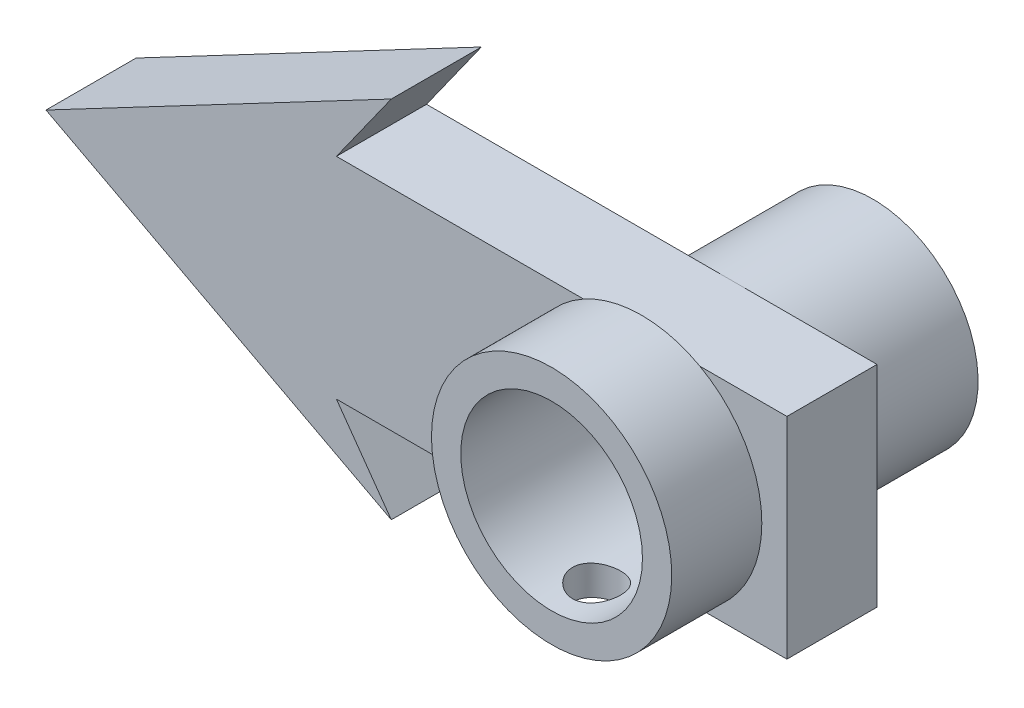
ISO-10303-21;
HEADER;
FILE_DESCRIPTION(('STEP AP214'),'2;1');
FILE_NAME('part.step','',(''),(''),'','','');
FILE_SCHEMA(('AUTOMOTIVE_DESIGN { 1 0 10303 214 1 1 1 1 }'));
ENDSEC;
DATA;
#1=APPLICATION_CONTEXT('core data for automotive mechanical design processes');
#2=APPLICATION_PROTOCOL_DEFINITION('international standard','automotive_design',2000,#1);
#3=PRODUCT_CONTEXT('',#1,'mechanical');
#4=PRODUCT('Part','Part','',(#3));
#5=PRODUCT_RELATED_PRODUCT_CATEGORY('part','',(#4));
#6=PRODUCT_DEFINITION_FORMATION('','',#4);
#7=PRODUCT_DEFINITION_CONTEXT('part definition',#1,'design');
#8=PRODUCT_DEFINITION('design','',#6,#7);
#9=PRODUCT_DEFINITION_SHAPE('','',#8);
#10=(LENGTH_UNIT() NAMED_UNIT(*) SI_UNIT(.MILLI.,.METRE.));
#11=(NAMED_UNIT(*) PLANE_ANGLE_UNIT() SI_UNIT($,.RADIAN.));
#12=(NAMED_UNIT(*) SI_UNIT($,.STERADIAN.) SOLID_ANGLE_UNIT());
#13=UNCERTAINTY_MEASURE_WITH_UNIT(LENGTH_MEASURE(1.E-05),#10,'distance_accuracy_value','');
#14=(GEOMETRIC_REPRESENTATION_CONTEXT(3) GLOBAL_UNCERTAINTY_ASSIGNED_CONTEXT((#13)) GLOBAL_UNIT_ASSIGNED_CONTEXT((#10,
#11,#12)) REPRESENTATION_CONTEXT('',''));
#15=CARTESIAN_POINT('',(0.,0.,0.));
#16=DIRECTION('',(0.,0.,1.));
#17=DIRECTION('',(1.,0.,0.));
#18=AXIS2_PLACEMENT_3D('',#15,#16,#17);
#19=CARTESIAN_POINT('',(0.,0.,0.));
#20=DIRECTION('',(0.,0.,-1.));
#21=DIRECTION('',(-1.,0.,0.));
#22=AXIS2_PLACEMENT_3D('',#19,#20,#21);
#23=PLANE('',#22);
#24=DIRECTION('',(-1.,0.,0.));
#25=VECTOR('',#24,1.);
#26=CARTESIAN_POINT('',(9.67008036930227,3.5,0.));
#27=LINE('',#26,#25);
#28=CARTESIAN_POINT('',(24.6700803693023,3.5,0.));
#29=VERTEX_POINT('',#28);
#30=CARTESIAN_POINT('',(19.8350401846511,3.5,0.));
#31=VERTEX_POINT('',#30);
#32=EDGE_CURVE('E169',#29,#31,#27,.T.);
#33=ORIENTED_EDGE('',*,*,#32,.F.);
#34=DIRECTION('',(0.,1.,0.));
#35=VECTOR('',#34,1.);
#36=CARTESIAN_POINT('',(24.6700803693023,3.5,0.));
#37=LINE('',#36,#35);
#38=CARTESIAN_POINT('',(24.6700803693023,-3.5,0.));
#39=VERTEX_POINT('',#38);
#40=EDGE_CURVE('E129',#39,#29,#37,.T.);
#41=ORIENTED_EDGE('',*,*,#40,.F.);
#42=DIRECTION('',(1.,0.,0.));
#43=VECTOR('',#42,1.);
#44=CARTESIAN_POINT('',(9.67008036930227,-3.5,0.));
#45=LINE('',#44,#43);
#46=CARTESIAN_POINT('',(19.8350401846511,-3.5,0.));
#47=VERTEX_POINT('',#46);
#48=EDGE_CURVE('E128',#47,#39,#45,.T.);
#49=ORIENTED_EDGE('',*,*,#48,.F.);
#50=CARTESIAN_POINT('',(19.8350401846511,0.,0.));
#51=DIRECTION('',(0.,0.,-1.));
#52=DIRECTION('',(-1.,0.,0.));
#53=AXIS2_PLACEMENT_3D('',#50,#51,#52);
#54=CIRCLE('',#53,3.5);
#55=EDGE_CURVE('E46',#31,#47,#54,.T.);
#56=ORIENTED_EDGE('',*,*,#55,.F.);
#57=EDGE_LOOP('',(#33,#41,#49,#56));
#58=FACE_BOUND('',#57,.T.);
#59=ADVANCED_FACE('F35',(#58),#23,.T.);
#60=CARTESIAN_POINT('',(9.67008036930227,-3.5,3.));
#61=DIRECTION('',(0.,1.,0.));
#62=DIRECTION('',(-1.,0.,0.));
#63=AXIS2_PLACEMENT_3D('',#60,#61,#62);
#64=PLANE('',#63);
#65=DIRECTION('',(0.,0.,-1.));
#66=VECTOR('',#65,1.);
#67=CARTESIAN_POINT('',(24.6700803693023,-3.5,3.));
#68=LINE('',#67,#66);
#69=CARTESIAN_POINT('',(24.6700803693023,-3.5,3.));
#70=VERTEX_POINT('',#69);
#71=EDGE_CURVE('E115',#70,#39,#68,.T.);
#72=ORIENTED_EDGE('',*,*,#71,.F.);
#73=DIRECTION('',(1.,0.,0.));
#74=VECTOR('',#73,1.);
#75=CARTESIAN_POINT('',(9.67008036930227,-3.5,3.));
#76=LINE('',#75,#74);
#77=CARTESIAN_POINT('',(21.7715318577548,-3.5,3.));
#78=VERTEX_POINT('',#77);
#79=EDGE_CURVE('E125',#78,#70,#76,.T.);
#80=ORIENTED_EDGE('',*,*,#79,.F.);
#81=CARTESIAN_POINT('',(17.8985485115474,-3.5,3.));
#82=VERTEX_POINT('',#81);
#83=EDGE_CURVE('E134',#82,#78,#76,.T.);
#84=ORIENTED_EDGE('',*,*,#83,.F.);
#85=CARTESIAN_POINT('',(9.67008036930227,-3.5,3.));
#86=VERTEX_POINT('',#85);
#87=EDGE_CURVE('E137',#86,#82,#76,.T.);
#88=ORIENTED_EDGE('',*,*,#87,.F.);
#89=DIRECTION('',(0.,0.,-1.));
#90=VECTOR('',#89,1.);
#91=CARTESIAN_POINT('',(9.67008036930227,-3.5,3.));
#92=LINE('',#91,#90);
#93=CARTESIAN_POINT('',(9.67008036930227,-3.5,0.));
#94=VERTEX_POINT('',#93);
#95=EDGE_CURVE('E182',#86,#94,#92,.T.);
#96=ORIENTED_EDGE('',*,*,#95,.T.);
#97=EDGE_CURVE('E166',#94,#47,#45,.T.);
#98=ORIENTED_EDGE('',*,*,#97,.T.);
#99=ORIENTED_EDGE('',*,*,#48,.T.);
#100=EDGE_LOOP('',(#72,#80,#84,#88,#96,#98,#99));
#101=FACE_BOUND('',#100,.T.);
#102=ADVANCED_FACE('F124',(#101),#64,.F.);
#103=CARTESIAN_POINT('',(9.67008036930227,3.5,3.));
#104=DIRECTION('',(0.,-1.,0.));
#105=DIRECTION('',(1.,0.,0.));
#106=AXIS2_PLACEMENT_3D('',#103,#104,#105);
#107=PLANE('',#106);
#108=DIRECTION('',(0.,0.,1.));
#109=VECTOR('',#108,1.);
#110=CARTESIAN_POINT('',(24.6700803693023,3.5,3.));
#111=LINE('',#110,#109);
#112=CARTESIAN_POINT('',(24.6700803693023,3.5,3.));
#113=VERTEX_POINT('',#112);
#114=EDGE_CURVE('E53',#29,#113,#111,.T.);
#115=ORIENTED_EDGE('',*,*,#114,.F.);
#116=ORIENTED_EDGE('',*,*,#32,.T.);
#117=CARTESIAN_POINT('',(9.67008036930227,3.5,0.));
#118=VERTEX_POINT('',#117);
#119=EDGE_CURVE('E168',#31,#118,#27,.T.);
#120=ORIENTED_EDGE('',*,*,#119,.T.);
#121=DIRECTION('',(0.,0.,-1.));
#122=VECTOR('',#121,1.);
#123=CARTESIAN_POINT('',(9.67008036930227,3.5,3.));
#124=LINE('',#123,#122);
#125=CARTESIAN_POINT('',(9.67008036930227,3.5,3.));
#126=VERTEX_POINT('',#125);
#127=EDGE_CURVE('E180',#126,#118,#124,.T.);
#128=ORIENTED_EDGE('',*,*,#127,.F.);
#129=DIRECTION('',(-1.,0.,0.));
#130=VECTOR('',#129,1.);
#131=CARTESIAN_POINT('',(9.67008036930227,3.5,3.));
#132=LINE('',#131,#130);
#133=CARTESIAN_POINT('',(17.8985485115474,3.5,3.));
#134=VERTEX_POINT('',#133);
#135=EDGE_CURVE('E142',#134,#126,#132,.T.);
#136=ORIENTED_EDGE('',*,*,#135,.F.);
#137=CARTESIAN_POINT('',(21.7715318577548,3.5,3.));
#138=VERTEX_POINT('',#137);
#139=EDGE_CURVE('E146',#138,#134,#132,.T.);
#140=ORIENTED_EDGE('',*,*,#139,.F.);
#141=EDGE_CURVE('E147',#113,#138,#132,.T.);
#142=ORIENTED_EDGE('',*,*,#141,.F.);
#143=EDGE_LOOP('',(#115,#116,#120,#128,#136,#140,#142));
#144=FACE_BOUND('',#143,.T.);
#145=ADVANCED_FACE('F258',(#144),#107,.F.);
#146=CARTESIAN_POINT('',(0.,0.,3.));
#147=DIRECTION('',(0.,0.,-1.));
#148=DIRECTION('',(-1.,0.,0.));
#149=AXIS2_PLACEMENT_3D('',#146,#147,#148);
#150=PLANE('',#149);
#151=DIRECTION('',(0.,-1.,0.));
#152=VECTOR('',#151,1.);
#153=CARTESIAN_POINT('',(24.6700803693023,3.5,3.));
#154=LINE('',#153,#152);
#155=EDGE_CURVE('E112',#113,#70,#154,.T.);
#156=ORIENTED_EDGE('',*,*,#155,.F.);
#157=ORIENTED_EDGE('',*,*,#141,.T.);
#158=CARTESIAN_POINT('',(19.8350401846511,0.,3.));
#159=DIRECTION('',(0.,0.,1.));
#160=DIRECTION('',(1.,0.,0.));
#161=AXIS2_PLACEMENT_3D('',#158,#159,#160);
#162=CIRCLE('',#161,4.);
#163=EDGE_CURVE('E133',#78,#138,#162,.T.);
#164=ORIENTED_EDGE('',*,*,#163,.F.);
#165=ORIENTED_EDGE('',*,*,#79,.T.);
#166=EDGE_LOOP('',(#156,#157,#164,#165));
#167=FACE_BOUND('',#166,.T.);
#168=ADVANCED_FACE('F131',(#167),#150,.F.);
#169=EDGE_CURVE('E44',#134,#82,#162,.T.);
#170=ORIENTED_EDGE('',*,*,#169,.F.);
#171=ORIENTED_EDGE('',*,*,#135,.T.);
#172=DIRECTION('',(0.580022620305098,0.814600368238567,0.));
#173=VECTOR('',#172,1.);
#174=CARTESIAN_POINT('',(11.4976326065654,6.06666666666667,3.));
#175=LINE('',#174,#173);
#176=CARTESIAN_POINT('',(11.4976326065654,6.06666666666667,3.));
#177=VERTEX_POINT('',#176);
#178=EDGE_CURVE('E152',#126,#177,#175,.T.);
#179=ORIENTED_EDGE('',*,*,#178,.T.);
#180=DIRECTION('',(-0.884433277428106,-0.466666666666667,0.));
#181=VECTOR('',#180,1.);
#182=CARTESIAN_POINT('',(0.,0.,3.));
#183=LINE('',#182,#181);
#184=CARTESIAN_POINT('',(0.,0.,3.));
#185=VERTEX_POINT('',#184);
#186=EDGE_CURVE('E154',#177,#185,#183,.T.);
#187=ORIENTED_EDGE('',*,*,#186,.T.);
#188=DIRECTION('',(0.884433277428106,-0.466666666666667,0.));
#189=VECTOR('',#188,1.);
#190=CARTESIAN_POINT('',(0.,0.,3.));
#191=LINE('',#190,#189);
#192=CARTESIAN_POINT('',(11.4976326065654,-6.06666666666667,3.));
#193=VERTEX_POINT('',#192);
#194=EDGE_CURVE('E138',#185,#193,#191,.T.);
#195=ORIENTED_EDGE('',*,*,#194,.T.);
#196=DIRECTION('',(-0.580022620305098,0.814600368238567,0.));
#197=VECTOR('',#196,1.);
#198=CARTESIAN_POINT('',(11.4976326065654,-6.06666666666667,3.));
#199=LINE('',#198,#197);
#200=EDGE_CURVE('E135',#193,#86,#199,.T.);
#201=ORIENTED_EDGE('',*,*,#200,.T.);
#202=ORIENTED_EDGE('',*,*,#87,.T.);
#203=EDGE_LOOP('',(#170,#171,#179,#187,#195,#201,#202));
#204=FACE_BOUND('',#203,.T.);
#205=ADVANCED_FACE('F290',(#204),#150,.F.);
#206=CARTESIAN_POINT('',(0.,0.,3.));
#207=DIRECTION('',(0.466666666666667,0.884433277428107,0.));
#208=DIRECTION('',(-0.884433277428107,0.466666666666667,0.));
#209=AXIS2_PLACEMENT_3D('',#206,#207,#208);
#210=PLANE('',#209);
#211=DIRECTION('',(0.884433277428106,-0.466666666666667,0.));
#212=VECTOR('',#211,1.);
#213=CARTESIAN_POINT('',(0.,0.,0.));
#214=LINE('',#213,#212);
#215=CARTESIAN_POINT('',(0.,0.,0.));
#216=VERTEX_POINT('',#215);
#217=CARTESIAN_POINT('',(11.4976326065654,-6.06666666666667,0.));
#218=VERTEX_POINT('',#217);
#219=EDGE_CURVE('E160',#216,#218,#214,.T.);
#220=ORIENTED_EDGE('',*,*,#219,.T.);
#221=DIRECTION('',(0.,0.,-1.));
#222=VECTOR('',#221,1.);
#223=CARTESIAN_POINT('',(11.4976326065654,-6.06666666666667,3.));
#224=LINE('',#223,#222);
#225=EDGE_CURVE('E39',#193,#218,#224,.T.);
#226=ORIENTED_EDGE('',*,*,#225,.F.);
#227=ORIENTED_EDGE('',*,*,#194,.F.);
#228=DIRECTION('',(0.,0.,-1.));
#229=VECTOR('',#228,1.);
#230=CARTESIAN_POINT('',(0.,0.,3.));
#231=LINE('',#230,#229);
#232=EDGE_CURVE('E157',#185,#216,#231,.T.);
#233=ORIENTED_EDGE('',*,*,#232,.T.);
#234=EDGE_LOOP('',(#220,#226,#227,#233));
#235=FACE_BOUND('',#234,.T.);
#236=ADVANCED_FACE('F37',(#235),#210,.F.);
#237=CARTESIAN_POINT('',(11.4976326065654,-6.06666666666667,3.));
#238=DIRECTION('',(-0.814600368238567,-0.580022620305098,0.));
#239=DIRECTION('',(0.580022620305098,-0.814600368238567,0.));
#240=AXIS2_PLACEMENT_3D('',#237,#238,#239);
#241=PLANE('',#240);
#242=DIRECTION('',(-0.580022620305098,0.814600368238567,0.));
#243=VECTOR('',#242,1.);
#244=CARTESIAN_POINT('',(11.4976326065654,-6.06666666666667,0.));
#245=LINE('',#244,#243);
#246=EDGE_CURVE('E163',#218,#94,#245,.T.);
#247=ORIENTED_EDGE('',*,*,#246,.T.);
#248=ORIENTED_EDGE('',*,*,#95,.F.);
#249=ORIENTED_EDGE('',*,*,#200,.F.);
#250=ORIENTED_EDGE('',*,*,#225,.T.);
#251=EDGE_LOOP('',(#247,#248,#249,#250));
#252=FACE_BOUND('',#251,.T.);
#253=ADVANCED_FACE('F280',(#252),#241,.F.);
#254=CARTESIAN_POINT('',(11.4976326065654,6.06666666666667,3.));
#255=DIRECTION('',(-0.814600368238567,0.580022620305098,0.));
#256=DIRECTION('',(-0.580022620305098,-0.814600368238567,0.));
#257=AXIS2_PLACEMENT_3D('',#254,#255,#256);
#258=PLANE('',#257);
#259=DIRECTION('',(0.580022620305098,0.814600368238567,0.));
#260=VECTOR('',#259,1.);
#261=CARTESIAN_POINT('',(11.4976326065654,6.06666666666667,0.));
#262=LINE('',#261,#260);
#263=CARTESIAN_POINT('',(11.4976326065654,6.06666666666667,0.));
#264=VERTEX_POINT('',#263);
#265=EDGE_CURVE('E171',#118,#264,#262,.T.);
#266=ORIENTED_EDGE('',*,*,#265,.T.);
#267=DIRECTION('',(0.,0.,-1.));
#268=VECTOR('',#267,1.);
#269=CARTESIAN_POINT('',(11.4976326065654,6.06666666666667,3.));
#270=LINE('',#269,#268);
#271=EDGE_CURVE('E177',#177,#264,#270,.T.);
#272=ORIENTED_EDGE('',*,*,#271,.F.);
#273=ORIENTED_EDGE('',*,*,#178,.F.);
#274=ORIENTED_EDGE('',*,*,#127,.T.);
#275=EDGE_LOOP('',(#266,#272,#273,#274));
#276=FACE_BOUND('',#275,.T.);
#277=ADVANCED_FACE('F275',(#276),#258,.F.);
#278=CARTESIAN_POINT('',(0.,0.,3.));
#279=DIRECTION('',(0.466666666666667,-0.884433277428107,0.));
#280=DIRECTION('',(0.884433277428107,0.466666666666667,0.));
#281=AXIS2_PLACEMENT_3D('',#278,#279,#280);
#282=PLANE('',#281);
#283=DIRECTION('',(-0.884433277428106,-0.466666666666667,0.));
#284=VECTOR('',#283,1.);
#285=CARTESIAN_POINT('',(0.,0.,0.));
#286=LINE('',#285,#284);
#287=EDGE_CURVE('E173',#264,#216,#286,.T.);
#288=ORIENTED_EDGE('',*,*,#287,.T.);
#289=ORIENTED_EDGE('',*,*,#232,.F.);
#290=ORIENTED_EDGE('',*,*,#186,.F.);
#291=ORIENTED_EDGE('',*,*,#271,.T.);
#292=EDGE_LOOP('',(#288,#289,#290,#291));
#293=FACE_BOUND('',#292,.T.);
#294=ADVANCED_FACE('F265',(#293),#282,.F.);
#295=EDGE_CURVE('E11',#47,#31,#54,.T.);
#296=ORIENTED_EDGE('',*,*,#295,.F.);
#297=ORIENTED_EDGE('',*,*,#97,.F.);
#298=ORIENTED_EDGE('',*,*,#246,.F.);
#299=ORIENTED_EDGE('',*,*,#219,.F.);
#300=ORIENTED_EDGE('',*,*,#287,.F.);
#301=ORIENTED_EDGE('',*,*,#265,.F.);
#302=ORIENTED_EDGE('',*,*,#119,.F.);
#303=EDGE_LOOP('',(#296,#297,#298,#299,#300,#301,#302));
#304=FACE_BOUND('',#303,.T.);
#305=ADVANCED_FACE('F253',(#304),#23,.T.);
#306=CARTESIAN_POINT('',(19.8350401846511,0.,3.));
#307=DIRECTION('',(0.,0.,1.));
#308=DIRECTION('',(1.,0.,0.));
#309=AXIS2_PLACEMENT_3D('',#306,#307,#308);
#310=PLANE('',#309);
#311=EDGE_CURVE('E195',#82,#78,#162,.T.);
#312=ORIENTED_EDGE('',*,*,#311,.F.);
#313=ORIENTED_EDGE('',*,*,#83,.T.);
#314=EDGE_LOOP('',(#312,#313));
#315=FACE_BOUND('',#314,.T.);
#316=ADVANCED_FACE('F264',(#315),#310,.F.);
#317=EDGE_CURVE('E189',#138,#134,#162,.T.);
#318=ORIENTED_EDGE('',*,*,#317,.F.);
#319=ORIENTED_EDGE('',*,*,#139,.T.);
#320=EDGE_LOOP('',(#318,#319));
#321=FACE_BOUND('',#320,.T.);
#322=ADVANCED_FACE('F271',(#321),#310,.F.);
#323=CARTESIAN_POINT('',(19.8350401846511,0.,6.));
#324=DIRECTION('',(0.,0.,-1.));
#325=DIRECTION('',(-1.,0.,0.));
#326=AXIS2_PLACEMENT_3D('',#323,#324,#325);
#327=CYLINDRICAL_SURFACE('',#326,4.);
#328=CARTESIAN_POINT('',(19.8350401846511,-4.,5.3));
#329=CARTESIAN_POINT('',(19.790578659217,-3.99999918064697,5.29999836440132));
#330=CARTESIAN_POINT('',(19.7460964564899,-3.99925108142585,5.29628092562588));
#331=CARTESIAN_POINT('',(19.6583893784999,-3.99633892498585,5.2815211999078));
#332=CARTESIAN_POINT('',(19.6151655306181,-3.99417374288149,5.27047309375879));
#333=CARTESIAN_POINT('',(19.5312559404405,-3.98866919422629,5.24140698110337));
#334=CARTESIAN_POINT('',(19.4905678103046,-3.98533095261374,5.22339565052425));
#335=CARTESIAN_POINT('',(19.4127937935598,-3.97784318428251,5.18093420199096));
#336=CARTESIAN_POINT('',(19.3757076925905,-3.97369370588566,5.15648446751424));
#337=CARTESIAN_POINT('',(19.3056854027992,-3.96497732263976,5.10148920456685));
#338=CARTESIAN_POINT('',(19.2728050237243,-3.96040596403478,5.07087331568704));
#339=CARTESIAN_POINT('',(19.2126107793647,-3.95139344362071,5.00456606688664));
#340=CARTESIAN_POINT('',(19.1852973488348,-3.94695229200339,4.9688743109319));
#341=CARTESIAN_POINT('',(19.136774781973,-3.93865953450092,4.8930270455905));
#342=CARTESIAN_POINT('',(19.1156234335584,-3.93481365891957,4.85283388496291));
#343=CARTESIAN_POINT('',(19.0803956513869,-3.92821014446734,4.76937454479674));
#344=CARTESIAN_POINT('',(19.0663185187013,-3.92545239809569,4.72610866932292));
#345=CARTESIAN_POINT('',(19.0458199447433,-3.92138244201764,4.63833250887367));
#346=CARTESIAN_POINT('',(19.0393005862841,-3.9200517608575,4.59384596468622));
#347=CARTESIAN_POINT('',(19.0337984824702,-3.91893100048502,4.50439214290853));
#348=CARTESIAN_POINT('',(19.0348149664803,-3.91914076374272,4.45942491494388));
#349=CARTESIAN_POINT('',(19.0442765261697,-3.92106040918548,4.3710025695832));
#350=CARTESIAN_POINT('',(19.052609352456,-3.92274762287011,4.32753487549815));
#351=CARTESIAN_POINT('',(19.0762898769527,-3.92739636928001,4.2426271386696));
#352=CARTESIAN_POINT('',(19.0916379101706,-3.93035796286223,4.20118719286479));
#353=CARTESIAN_POINT('',(19.1290203577114,-3.93724494800326,4.12118779063712));
#354=CARTESIAN_POINT('',(19.1510992636654,-3.94117671850963,4.08264969634466));
#355=CARTESIAN_POINT('',(19.201285324993,-3.94955695018449,4.00978332002175));
#356=CARTESIAN_POINT('',(19.2293931731657,-3.95400547070693,3.97545552251908));
#357=CARTESIAN_POINT('',(19.2914402370027,-3.96301616993169,3.91133647803445));
#358=CARTESIAN_POINT('',(19.3254752556812,-3.96757895368724,3.8816379457127));
#359=CARTESIAN_POINT('',(19.3980921654015,-3.97623078971527,3.82835692295902));
#360=CARTESIAN_POINT('',(19.4366741147476,-3.98031983591179,3.80477451096514));
#361=CARTESIAN_POINT('',(19.517392675148,-3.9875735212871,3.76437799261922));
#362=CARTESIAN_POINT('',(19.5595347289829,-3.99073671078617,3.74757448508437));
#363=CARTESIAN_POINT('',(19.6461210034922,-3.99577127190287,3.72131162076915));
#364=CARTESIAN_POINT('',(19.6905649445932,-3.99764280000425,3.7118513743411));
#365=CARTESIAN_POINT('',(19.7796966601494,-3.99986137493494,3.70067483696458));
#366=CARTESIAN_POINT('',(19.8243679219907,-4.00023339721976,3.69883166436779));
#367=CARTESIAN_POINT('',(19.9133801320053,-3.99948041544082,3.70259988715374));
#368=CARTESIAN_POINT('',(19.9577210986062,-3.99835549553157,3.70821086348208));
#369=CARTESIAN_POINT('',(20.0444047126084,-3.99475065606414,3.72662269883516));
#370=CARTESIAN_POINT('',(20.0867617433231,-3.99228301123365,3.73935845479832));
#371=CARTESIAN_POINT('',(20.1687390866509,-3.98626841648826,3.77158718612465));
#372=CARTESIAN_POINT('',(20.2083591939612,-3.98272138571381,3.79108066774146));
#373=CARTESIAN_POINT('',(20.2842731236001,-3.97487929226635,3.83654599252105));
#374=CARTESIAN_POINT('',(20.3205202860529,-3.97057560349641,3.86259422483116));
#375=CARTESIAN_POINT('',(20.3881745999465,-3.96171787863906,3.92032735296583));
#376=CARTESIAN_POINT('',(20.4195812317957,-3.9571638157471,3.95201285311989));
#377=CARTESIAN_POINT('',(20.4771526572705,-3.94823442845572,4.0206986815129));
#378=CARTESIAN_POINT('',(20.5032303466101,-3.94386288186643,4.05777259537707));
#379=CARTESIAN_POINT('',(20.5487885206921,-3.93587353436955,4.13584908908534));
#380=CARTESIAN_POINT('',(20.5682692693895,-3.93225570330674,4.17685151165884));
#381=CARTESIAN_POINT('',(20.5999616579167,-3.92621392467506,4.26141459691963));
#382=CARTESIAN_POINT('',(20.612210984484,-3.92378379897749,4.30496067296825));
#383=CARTESIAN_POINT('',(20.6292071059529,-3.9203794943362,4.39354676279272));
#384=CARTESIAN_POINT('',(20.6339548792312,-3.91940512552889,4.43858658096747));
#385=CARTESIAN_POINT('',(20.6357769133451,-3.91903319705103,4.52800709163545));
#386=CARTESIAN_POINT('',(20.6329888151079,-3.91960735351441,4.5723849191416));
#387=CARTESIAN_POINT('',(20.6201220279312,-3.92220458787691,4.66002531992402));
#388=CARTESIAN_POINT('',(20.6100433975546,-3.92422765413735,4.70328790215584));
#389=CARTESIAN_POINT('',(20.5829430394503,-3.92948211375327,4.78738216899243));
#390=CARTESIAN_POINT('',(20.565938190025,-3.93271056815064,4.82821948840193));
#391=CARTESIAN_POINT('',(20.5254839003324,-3.94001371979336,4.90648297658755));
#392=CARTESIAN_POINT('',(20.502033919671,-3.94408848799115,4.94390885898011));
#393=CARTESIAN_POINT('',(20.4488849164803,-3.9527116841858,5.01497245772025));
#394=CARTESIAN_POINT('',(20.4190864944393,-3.9572669832776,5.04853501221407));
#395=CARTESIAN_POINT('',(20.3542916798616,-3.96628865497564,5.11022896442333));
#396=CARTESIAN_POINT('',(20.3192940943738,-3.97075500690547,5.13835911225381));
#397=CARTESIAN_POINT('',(20.2446542879217,-3.97915065910377,5.18866771515715));
#398=CARTESIAN_POINT('',(20.204967292195,-3.98307384975397,5.21078080262402));
#399=CARTESIAN_POINT('',(20.1223732734037,-3.98988100068,5.24798889807727));
#400=CARTESIAN_POINT('',(20.0794691933416,-3.99276589710893,5.26309023162599));
#401=CARTESIAN_POINT('',(20.0028973757902,-3.99661098076296,5.28292155843577));
#402=CARTESIAN_POINT('',(19.9696655158622,-3.99787442526761,5.2893145549662));
#403=CARTESIAN_POINT('',(19.9026398048192,-3.99956923311914,5.29785432988669));
#404=CARTESIAN_POINT('',(19.86884597165,-4.00000062298524,5.30000124360781));
#405=CARTESIAN_POINT('',(19.8350401846511,-4.,5.3));
#406=B_SPLINE_CURVE_WITH_KNOTS('',3,(#328,#329,#330,#331,#332,#333,#334,#335,#336,#337,#338,
#339,#340,#341,#342,#343,#344,#345,#346,#347,#348,#349,#350,#351,#352,#353,#354,#355,#356,#357,
#358,#359,#360,#361,#362,#363,#364,#365,#366,#367,#368,#369,#370,#371,#372,#373,#374,#375,#376,
#377,#378,#379,#380,#381,#382,#383,#384,#385,#386,#387,#388,#389,#390,#391,#392,#393,#394,#395,
#396,#397,#398,#399,#400,#401,#402,#403,#404,#405),.UNSPECIFIED.,.T.,.F.,(4,2,2,2,2,2,2,2,2,2,2,
2,2,2,2,2,2,2,2,2,2,2,2,2,2,2,2,2,2,2,2,2,2,2,2,2,2,2,4),(0.,0.133260904529008,
0.266627720553057,0.39986698820027,0.533098321784688,0.667946136089745,0.802804477397891,
0.938889560047378,1.07496119492157,1.20924948082869,1.3435240342498,1.47577381605022,
1.60802991402983,1.74117992162873,1.87434523799736,2.0099060199308,2.14546854031856,
2.28124219883219,2.41699940558428,2.55048588541012,2.68396486126294,2.81624363160578,
2.94853231372817,3.08244052826686,3.21636310676744,3.3523250286338,3.48828150978772,
3.62352304826177,3.75874694664331,3.8915177805416,4.02428754794086,4.15673569002487,
4.28919494065492,4.42390460991314,4.55864523626344,4.69479597340509,4.83082364414014,
4.93215020231914,5.03347353096796),.UNSPECIFIED.);
#407=CARTESIAN_POINT('',(19.8350401846511,-4.,5.3));
#408=VERTEX_POINT('',#407);
#409=EDGE_CURVE('E206',#408,#408,#406,.T.);
#410=ORIENTED_EDGE('',*,*,#409,.F.);
#411=EDGE_LOOP('',(#410));
#412=FACE_BOUND('',#411,.T.);
#413=CARTESIAN_POINT('',(19.8350401846511,0.,6.));
#414=DIRECTION('',(0.,0.,1.));
#415=DIRECTION('',(1.,0.,0.));
#416=AXIS2_PLACEMENT_3D('',#413,#414,#415);
#417=CIRCLE('',#416,4.);
#418=CARTESIAN_POINT('',(23.8350401846511,0.,6.));
#419=VERTEX_POINT('',#418);
#420=EDGE_CURVE('E164',#419,#419,#417,.T.);
#421=ORIENTED_EDGE('',*,*,#420,.F.);
#422=EDGE_LOOP('',(#421));
#423=FACE_BOUND('',#422,.T.);
#424=ORIENTED_EDGE('',*,*,#317,.T.);
#425=ORIENTED_EDGE('',*,*,#169,.T.);
#426=ORIENTED_EDGE('',*,*,#311,.T.);
#427=ORIENTED_EDGE('',*,*,#163,.T.);
#428=EDGE_LOOP('',(#424,#425,#426,#427));
#429=FACE_BOUND('',#428,.T.);
#430=ADVANCED_FACE('F310',(#412,#423,#429),#327,.T.);
#431=CARTESIAN_POINT('',(19.8350401846511,0.,6.));
#432=DIRECTION('',(0.,0.,1.));
#433=DIRECTION('',(1.,0.,0.));
#434=AXIS2_PLACEMENT_3D('',#431,#432,#433);
#435=PLANE('',#434);
#436=CARTESIAN_POINT('',(19.8350401846511,0.,6.));
#437=DIRECTION('',(0.,0.,1.));
#438=DIRECTION('',(1.,0.,0.));
#439=AXIS2_PLACEMENT_3D('',#436,#437,#438);
#440=CIRCLE('',#439,3.025);
#441=CARTESIAN_POINT('',(22.8600401846511,0.,6.));
#442=VERTEX_POINT('',#441);
#443=EDGE_CURVE('E199',#442,#442,#440,.T.);
#444=ORIENTED_EDGE('',*,*,#443,.F.);
#445=EDGE_LOOP('',(#444));
#446=FACE_BOUND('',#445,.T.);
#447=ORIENTED_EDGE('',*,*,#420,.T.);
#448=EDGE_LOOP('',(#447));
#449=FACE_BOUND('',#448,.T.);
#450=ADVANCED_FACE('F314',(#446,#449),#435,.T.);
#451=CARTESIAN_POINT('',(19.8350401846511,0.,-0.00100000000000013));
#452=DIRECTION('',(0.,0.,1.));
#453=DIRECTION('',(1.,0.,0.));
#454=AXIS2_PLACEMENT_3D('',#451,#452,#453);
#455=CYLINDRICAL_SURFACE('',#454,3.025);
#456=CARTESIAN_POINT('',(19.8350401846511,-3.025,5.3));
#457=CARTESIAN_POINT('',(19.8791553962452,-3.02499932224319,5.29999892545121));
#458=CARTESIAN_POINT('',(19.9232821865711,-3.0240254531158,5.29633872579703));
#459=CARTESIAN_POINT('',(20.0102654801861,-3.02023504644452,5.28182000667694));
#460=CARTESIAN_POINT('',(20.0531213466025,-3.01741760084727,5.27095793989727));
#461=CARTESIAN_POINT('',(20.1362945785452,-3.01025115086492,5.24241266354656));
#462=CARTESIAN_POINT('',(20.1766151105835,-3.00590410353821,5.22473816743665));
#463=CARTESIAN_POINT('',(20.2537195262333,-2.99613833625605,5.18310182660626));
#464=CARTESIAN_POINT('',(20.2905031894552,-2.99071954958252,5.15913959043008));
#465=CARTESIAN_POINT('',(20.3603297357938,-2.9792574187581,5.10503018677773));
#466=CARTESIAN_POINT('',(20.3932803392676,-2.973203538056,5.07476616426055));
#467=CARTESIAN_POINT('',(20.4537025169986,-2.96122150040223,5.00916212500279));
#468=CARTESIAN_POINT('',(20.4811733981312,-2.9552933594399,4.9738214670949));
#469=CARTESIAN_POINT('',(20.530304109301,-2.9441264396478,4.89833348706738));
#470=CARTESIAN_POINT('',(20.5518581769232,-2.93890096585341,4.8581151816542));
#471=CARTESIAN_POINT('',(20.587862349401,-2.92988577514898,4.77446509721844));
#472=CARTESIAN_POINT('',(20.6023137402393,-2.92609579836202,4.73103390154864));
#473=CARTESIAN_POINT('',(20.6233826216071,-2.92048943499608,4.64321189972327));
#474=CARTESIAN_POINT('',(20.6301672343293,-2.91863101927515,4.59886393489742));
#475=CARTESIAN_POINT('',(20.6362309340062,-2.91697259096672,4.50962332135602));
#476=CARTESIAN_POINT('',(20.6355113984391,-2.91717220060345,4.46473077411636));
#477=CARTESIAN_POINT('',(20.6267199943164,-2.9195696315441,4.37697654304662));
#478=CARTESIAN_POINT('',(20.6188499284014,-2.92171260403595,4.33409290599841));
#479=CARTESIAN_POINT('',(20.5963039032491,-2.92766753404706,4.25027745595959));
#480=CARTESIAN_POINT('',(20.5816274080528,-2.93147962299634,4.20934579695366));
#481=CARTESIAN_POINT('',(20.5457196788588,-2.94039177500884,4.13006813518248));
#482=CARTESIAN_POINT('',(20.5244173610819,-2.9455056908745,4.09175595184956));
#483=CARTESIAN_POINT('',(20.475912288297,-2.95643779011322,4.01917889128369));
#484=CARTESIAN_POINT('',(20.4487083891106,-2.96225610995689,3.98491480087353));
#485=CARTESIAN_POINT('',(20.3881387114584,-2.97417010530146,3.92025310120462));
#486=CARTESIAN_POINT('',(20.3546033556075,-2.98026869274261,3.89001465420732));
#487=CARTESIAN_POINT('',(20.2828633535916,-2.99188867872063,3.83555854546924));
#488=CARTESIAN_POINT('',(20.2446585294348,-2.99741005524037,3.81134111334546));
#489=CARTESIAN_POINT('',(20.1644202393951,-3.00728655459728,3.76954599590647));
#490=CARTESIAN_POINT('',(20.122371322146,-3.01163666621077,3.75199671253727));
#491=CARTESIAN_POINT('',(20.0357788166024,-3.01864424778725,3.72426187219438));
#492=CARTESIAN_POINT('',(19.9912357663869,-3.02130208131986,3.71407473347143));
#493=CARTESIAN_POINT('',(19.9022780662337,-3.02457081847858,3.70160233546438));
#494=CARTESIAN_POINT('',(19.8578957765689,-3.02523777448174,3.69910063495982));
#495=CARTESIAN_POINT('',(19.7693459300956,-3.02461055825274,3.70147295252101));
#496=CARTESIAN_POINT('',(19.7251783519416,-3.02331658513738,3.70634622171699));
#497=CARTESIAN_POINT('',(19.6390814288204,-3.01894906954996,3.72315248871173));
#498=CARTESIAN_POINT('',(19.5971269072056,-3.01590588650307,3.73496512151639));
#499=CARTESIAN_POINT('',(19.5157987695946,-3.00838483101976,3.76517533547686));
#500=CARTESIAN_POINT('',(19.4764254314277,-3.00390680444642,3.78357362411644));
#501=CARTESIAN_POINT('',(19.4005335787807,-2.99388104641153,3.82683679050349));
#502=CARTESIAN_POINT('',(19.3640850317722,-2.98831429603441,3.85181988747366));
#503=CARTESIAN_POINT('',(19.2958215131962,-2.97675476020495,3.90739453680833));
#504=CARTESIAN_POINT('',(19.2640074433968,-2.9707618921761,3.93798717805899));
#505=CARTESIAN_POINT('',(19.2050066161871,-2.95881992207768,4.00492191798451));
#506=CARTESIAN_POINT('',(19.1779724559239,-2.95287663117959,4.04139980953269));
#507=CARTESIAN_POINT('',(19.1304063589152,-2.94188959636135,4.11849967469158));
#508=CARTESIAN_POINT('',(19.109874147544,-2.93684581445219,4.15912147317855));
#509=CARTESIAN_POINT('',(19.0760493528599,-2.92828661160137,4.24315077385686));
#510=CARTESIAN_POINT('',(19.06271463788,-2.92476232107228,4.28654036446666));
#511=CARTESIAN_POINT('',(19.04356198785,-2.91963823504378,4.37505477126633));
#512=CARTESIAN_POINT('',(19.0377421703101,-2.91803795758397,4.42017914997215));
#513=CARTESIAN_POINT('',(19.033891481953,-2.91698287623959,4.50932124237178));
#514=CARTESIAN_POINT('',(19.0356155392639,-2.91746056414204,4.55332773054664));
#515=CARTESIAN_POINT('',(19.0462362098156,-2.92034980084135,4.64039849357709));
#516=CARTESIAN_POINT('',(19.0551326442111,-2.92276130141797,4.68346279189899));
#517=CARTESIAN_POINT('',(19.0797045367624,-2.92920660600117,4.76712399194551));
#518=CARTESIAN_POINT('',(19.0953288729486,-2.93322816014022,4.80773691846293));
#519=CARTESIAN_POINT('',(19.1328732696341,-2.94244092350604,4.88579547410045));
#520=CARTESIAN_POINT('',(19.1547943027167,-2.94763231339808,4.92324061276878));
#521=CARTESIAN_POINT('',(19.2050560423043,-2.95878772903816,4.99507243185443));
#522=CARTESIAN_POINT('',(19.2335643704405,-2.96476978488742,5.02933904070653));
#523=CARTESIAN_POINT('',(19.2958715972759,-2.97673089661133,5.09268161388355));
#524=CARTESIAN_POINT('',(19.3296717760939,-2.982709951408,5.12175631861477));
#525=CARTESIAN_POINT('',(19.4024571218031,-2.9941410209805,5.17448744536222));
#526=CARTESIAN_POINT('',(19.4415360224757,-2.99957938174844,5.19801769328223));
#527=CARTESIAN_POINT('',(19.5232370418228,-3.00916771008596,5.23813745455682));
#528=CARTESIAN_POINT('',(19.5658568287127,-3.01331851715628,5.25473149286832));
#529=CARTESIAN_POINT('',(19.6461149308314,-3.0193167867065,5.27830259592411));
#530=CARTESIAN_POINT('',(19.6834021741666,-3.02143258329422,5.28642040499455));
#531=CARTESIAN_POINT('',(19.7588035104142,-3.02427441656635,5.29726931465429));
#532=CARTESIAN_POINT('',(19.79691752418,-3.02500058569124,5.30000092858352));
#533=CARTESIAN_POINT('',(19.8350401846511,-3.025,5.3));
#534=B_SPLINE_CURVE_WITH_KNOTS('',3,(#456,#457,#458,#459,#460,#461,#462,#463,#464,#465,#466,
#467,#468,#469,#470,#471,#472,#473,#474,#475,#476,#477,#478,#479,#480,#481,#482,#483,#484,#485,
#486,#487,#488,#489,#490,#491,#492,#493,#494,#495,#496,#497,#498,#499,#500,#501,#502,#503,#504,
#505,#506,#507,#508,#509,#510,#511,#512,#513,#514,#515,#516,#517,#518,#519,#520,#521,#522,#523,
#524,#525,#526,#527,#528,#529,#530,#531,#532,#533),.UNSPECIFIED.,.T.,.F.,(4,2,2,2,2,2,2,2,2,2,2,
2,2,2,2,2,2,2,2,2,2,2,2,2,2,2,2,2,2,2,2,2,2,2,2,2,2,2,4),(0.,0.13220584284575,0.26447685272928,
0.396579239354186,0.528689852226708,0.663512137842464,0.79835146619644,0.935463769974056,
1.07255123958498,1.20658904197832,1.34060224052849,1.47094694902655,1.6013019230095,
1.73310665143732,1.86493695658525,2.00099340974513,2.13705505074848,2.2736898965538,
2.41029537776794,2.54301670446445,2.67572455526569,2.80619582068827,2.93668110658553,
3.06969081694968,3.20272637362939,3.33944722293591,3.47616229673715,3.61206816094644,
3.74793997398224,3.8794311798744,4.01091910709351,4.14142508138915,4.27195122439329,
4.40625975302724,4.54060082174832,4.67775431373605,4.81481819108556,4.92907625978589,
5.04332343841198),.UNSPECIFIED.);
#535=CARTESIAN_POINT('',(19.8350401846511,-3.025,5.3));
#536=VERTEX_POINT('',#535);
#537=EDGE_CURVE('E216',#536,#536,#534,.T.);
#538=ORIENTED_EDGE('',*,*,#537,.F.);
#539=EDGE_LOOP('',(#538));
#540=FACE_BOUND('',#539,.T.);
#541=CARTESIAN_POINT('',(19.8350401846511,0.,0.));
#542=DIRECTION('',(0.,0.,-1.));
#543=DIRECTION('',(-1.,0.,0.));
#544=AXIS2_PLACEMENT_3D('',#541,#542,#543);
#545=CIRCLE('',#544,3.025);
#546=CARTESIAN_POINT('',(16.8100401846511,0.,0.));
#547=VERTEX_POINT('',#546);
#548=EDGE_CURVE('E201',#547,#547,#545,.F.);
#549=ORIENTED_EDGE('',*,*,#548,.F.);
#550=EDGE_LOOP('',(#549));
#551=FACE_BOUND('',#550,.T.);
#552=ORIENTED_EDGE('',*,*,#443,.T.);
#553=EDGE_LOOP('',(#552));
#554=FACE_BOUND('',#553,.T.);
#555=ADVANCED_FACE('F373',(#540,#551,#554),#455,.F.);
#556=CARTESIAN_POINT('',(19.8350401846511,-6.06766666666667,4.5));
#557=DIRECTION('',(0.,1.,0.));
#558=DIRECTION('',(0.,0.,1.));
#559=AXIS2_PLACEMENT_3D('',#556,#557,#558);
#560=CYLINDRICAL_SURFACE('',#559,0.799999999999999);
#561=ORIENTED_EDGE('',*,*,#537,.T.);
#562=EDGE_LOOP('',(#561));
#563=FACE_BOUND('',#562,.T.);
#564=ORIENTED_EDGE('',*,*,#409,.T.);
#565=EDGE_LOOP('',(#564));
#566=FACE_BOUND('',#565,.T.);
#567=ADVANCED_FACE('F221',(#563,#566),#560,.F.);
#568=CARTESIAN_POINT('',(19.8350401846511,0.,-4.7));
#569=DIRECTION('',(0.,0.,-1.));
#570=DIRECTION('',(-1.,0.,0.));
#571=AXIS2_PLACEMENT_3D('',#568,#569,#570);
#572=PLANE('',#571);
#573=CARTESIAN_POINT('',(19.8350401846511,0.,-4.7));
#574=DIRECTION('',(0.,0.,-1.));
#575=DIRECTION('',(-1.,0.,0.));
#576=AXIS2_PLACEMENT_3D('',#573,#574,#575);
#577=CIRCLE('',#576,2.);
#578=CARTESIAN_POINT('',(17.8350401846511,0.,-4.7));
#579=VERTEX_POINT('',#578);
#580=EDGE_CURVE('E302',#579,#579,#577,.T.);
#581=ORIENTED_EDGE('',*,*,#580,.F.);
#582=EDGE_LOOP('',(#581));
#583=FACE_BOUND('',#582,.T.);
#584=CARTESIAN_POINT('',(19.8350401846511,0.,-4.7));
#585=DIRECTION('',(0.,0.,-1.));
#586=DIRECTION('',(-1.,0.,0.));
#587=AXIS2_PLACEMENT_3D('',#584,#585,#586);
#588=CIRCLE('',#587,3.5);
#589=CARTESIAN_POINT('',(16.3350401846511,0.,-4.7));
#590=VERTEX_POINT('',#589);
#591=EDGE_CURVE('E297',#590,#590,#588,.T.);
#592=ORIENTED_EDGE('',*,*,#591,.T.);
#593=EDGE_LOOP('',(#592));
#594=FACE_BOUND('',#593,.T.);
#595=ADVANCED_FACE('F231',(#583,#594),#572,.T.);
#596=CARTESIAN_POINT('',(19.8350401846511,0.,-4.7));
#597=DIRECTION('',(0.,0.,1.));
#598=DIRECTION('',(1.,0.,0.));
#599=AXIS2_PLACEMENT_3D('',#596,#597,#598);
#600=CYLINDRICAL_SURFACE('',#599,3.5);
#601=ORIENTED_EDGE('',*,*,#591,.F.);
#602=EDGE_LOOP('',(#601));
#603=FACE_BOUND('',#602,.T.);
#604=ORIENTED_EDGE('',*,*,#55,.T.);
#605=ORIENTED_EDGE('',*,*,#295,.T.);
#606=EDGE_LOOP('',(#604,#605));
#607=FACE_BOUND('',#606,.T.);
#608=ADVANCED_FACE('F227',(#603,#607),#600,.T.);
#609=CARTESIAN_POINT('',(19.8350401846511,0.,0.));
#610=DIRECTION('',(0.,0.,-1.));
#611=DIRECTION('',(-1.,0.,0.));
#612=AXIS2_PLACEMENT_3D('',#609,#610,#611);
#613=PLANE('',#612);
#614=ORIENTED_EDGE('',*,*,#548,.T.);
#615=EDGE_LOOP('',(#614));
#616=FACE_BOUND('',#615,.T.);
#617=ADVANCED_FACE('F230',(#616),#613,.F.);
#618=CARTESIAN_POINT('',(19.8350401846511,0.,-2.75));
#619=DIRECTION('',(0.,0.,-1.));
#620=DIRECTION('',(-1.,0.,0.));
#621=AXIS2_PLACEMENT_3D('',#618,#619,#620);
#622=CYLINDRICAL_SURFACE('',#621,2.);
#623=CARTESIAN_POINT('',(19.8350401846511,0.,-2.75));
#624=DIRECTION('',(0.,0.,-1.));
#625=DIRECTION('',(-1.,0.,0.));
#626=AXIS2_PLACEMENT_3D('',#623,#624,#625);
#627=CIRCLE('',#626,2.);
#628=CARTESIAN_POINT('',(17.8350401846511,0.,-2.75));
#629=VERTEX_POINT('',#628);
#630=EDGE_CURVE('E298',#629,#629,#627,.T.);
#631=ORIENTED_EDGE('',*,*,#630,.F.);
#632=EDGE_LOOP('',(#631));
#633=FACE_BOUND('',#632,.T.);
#634=ORIENTED_EDGE('',*,*,#580,.T.);
#635=EDGE_LOOP('',(#634));
#636=FACE_BOUND('',#635,.T.);
#637=ADVANCED_FACE('F235',(#633,#636),#622,.F.);
#638=CARTESIAN_POINT('',(19.8350401846511,0.,-2.75));
#639=DIRECTION('',(0.,0.,-1.));
#640=DIRECTION('',(-1.,0.,0.));
#641=AXIS2_PLACEMENT_3D('',#638,#639,#640);
#642=PLANE('',#641);
#643=ORIENTED_EDGE('',*,*,#630,.T.);
#644=EDGE_LOOP('',(#643));
#645=FACE_BOUND('',#644,.T.);
#646=ADVANCED_FACE('F242',(#645),#642,.T.);
#647=CARTESIAN_POINT('',(24.6700803693023,0.,0.));
#648=DIRECTION('',(1.,0.,0.));
#649=DIRECTION('',(0.,0.,-1.));
#650=AXIS2_PLACEMENT_3D('',#647,#648,#649);
#651=PLANE('',#650);
#652=ORIENTED_EDGE('',*,*,#155,.T.);
#653=ORIENTED_EDGE('',*,*,#71,.T.);
#654=ORIENTED_EDGE('',*,*,#40,.T.);
#655=ORIENTED_EDGE('',*,*,#114,.T.);
#656=EDGE_LOOP('',(#652,#653,#654,#655));
#657=FACE_BOUND('',#656,.T.);
#658=ADVANCED_FACE('F114',(#657),#651,.T.);
#659=CLOSED_SHELL('',(#59,#102,#145,#168,#205,#236,#253,#277,#294,#305,#316,#322,#430,#450,#555,
#567,#595,#608,#617,#637,#646,#658));
#660=MANIFOLD_SOLID_BREP('B2',#659);
#661=ADVANCED_BREP_SHAPE_REPRESENTATION('',(#18,#660),#14);
#662=SHAPE_DEFINITION_REPRESENTATION(#9,#661);
ENDSEC;
END-ISO-10303-21;
